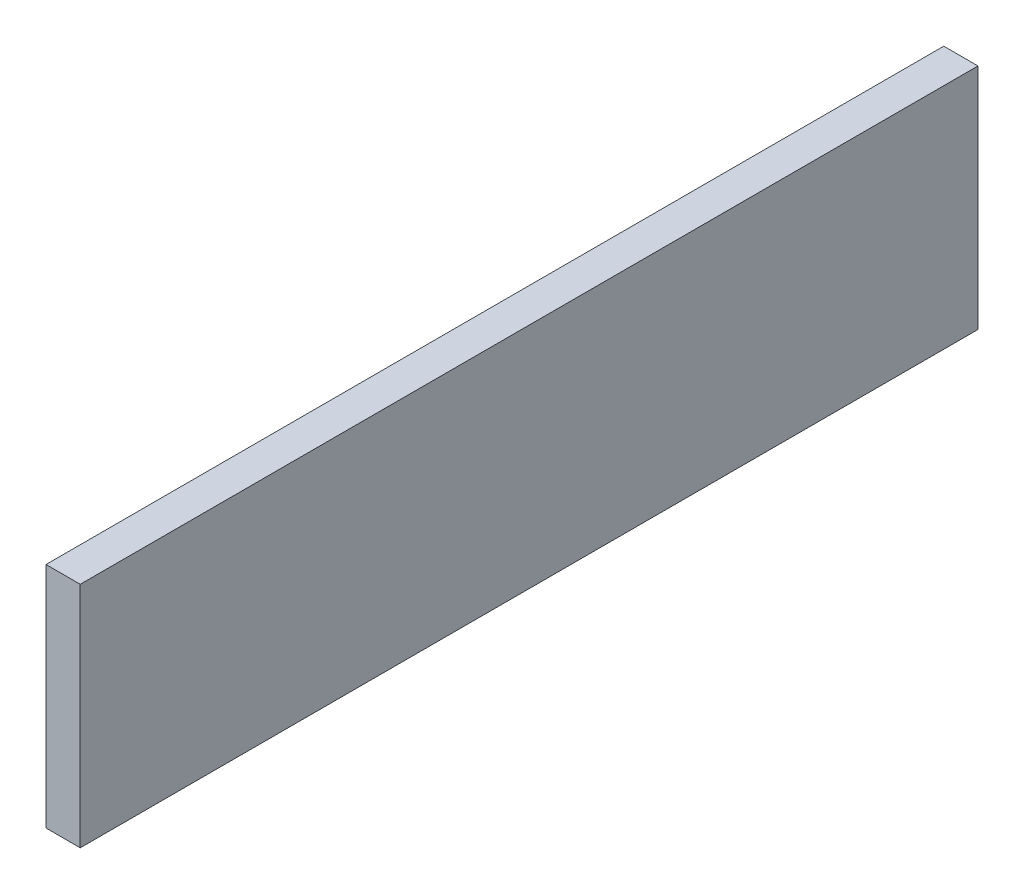
ISO-10303-21;
HEADER;
FILE_DESCRIPTION(('STEP AP214'),'2;1');
FILE_NAME('part.step','',(''),(''),'','','');
FILE_SCHEMA(('AUTOMOTIVE_DESIGN { 1 0 10303 214 1 1 1 1 }'));
ENDSEC;
DATA;
#1=APPLICATION_CONTEXT('core data for automotive mechanical design processes');
#2=APPLICATION_PROTOCOL_DEFINITION('international standard','automotive_design',2000,#1);
#3=PRODUCT_CONTEXT('',#1,'mechanical');
#4=PRODUCT('Part','Part','',(#3));
#5=PRODUCT_RELATED_PRODUCT_CATEGORY('part','',(#4));
#6=PRODUCT_DEFINITION_FORMATION('','',#4);
#7=PRODUCT_DEFINITION_CONTEXT('part definition',#1,'design');
#8=PRODUCT_DEFINITION('design','',#6,#7);
#9=PRODUCT_DEFINITION_SHAPE('','',#8);
#10=(LENGTH_UNIT() NAMED_UNIT(*) SI_UNIT(.MILLI.,.METRE.));
#11=(NAMED_UNIT(*) PLANE_ANGLE_UNIT() SI_UNIT($,.RADIAN.));
#12=(NAMED_UNIT(*) SI_UNIT($,.STERADIAN.) SOLID_ANGLE_UNIT());
#13=UNCERTAINTY_MEASURE_WITH_UNIT(LENGTH_MEASURE(1.E-05),#10,'distance_accuracy_value','');
#14=(GEOMETRIC_REPRESENTATION_CONTEXT(3) GLOBAL_UNCERTAINTY_ASSIGNED_CONTEXT((#13)) GLOBAL_UNIT_ASSIGNED_CONTEXT((#10,
#11,#12)) REPRESENTATION_CONTEXT('',''));
#15=CARTESIAN_POINT('',(0.,0.,0.));
#16=DIRECTION('',(0.,0.,1.));
#17=DIRECTION('',(1.,0.,0.));
#18=AXIS2_PLACEMENT_3D('',#15,#16,#17);
#19=CARTESIAN_POINT('',(18.,0.,0.));
#20=DIRECTION('',(0.,0.,-1.));
#21=DIRECTION('',(-1.,0.,0.));
#22=AXIS2_PLACEMENT_3D('',#19,#20,#21);
#23=PLANE('',#22);
#24=DIRECTION('',(0.,-1.,0.));
#25=VECTOR('',#24,1.);
#26=CARTESIAN_POINT('',(0.,0.,0.));
#27=LINE('',#26,#25);
#28=CARTESIAN_POINT('',(0.,120.,0.));
#29=VERTEX_POINT('',#28);
#30=CARTESIAN_POINT('',(0.,0.,0.));
#31=VERTEX_POINT('',#30);
#32=EDGE_CURVE('E96',#29,#31,#27,.T.);
#33=ORIENTED_EDGE('',*,*,#32,.T.);
#34=DIRECTION('',(-1.,0.,0.));
#35=VECTOR('',#34,1.);
#36=CARTESIAN_POINT('',(18.,0.,0.));
#37=LINE('',#36,#35);
#38=CARTESIAN_POINT('',(18.,0.,0.));
#39=VERTEX_POINT('',#38);
#40=EDGE_CURVE('E11',#39,#31,#37,.T.);
#41=ORIENTED_EDGE('',*,*,#40,.F.);
#42=DIRECTION('',(0.,-1.,0.));
#43=VECTOR('',#42,1.);
#44=CARTESIAN_POINT('',(18.,0.,0.));
#45=LINE('',#44,#43);
#46=CARTESIAN_POINT('',(18.,120.,0.));
#47=VERTEX_POINT('',#46);
#48=EDGE_CURVE('E84',#47,#39,#45,.T.);
#49=ORIENTED_EDGE('',*,*,#48,.F.);
#50=DIRECTION('',(-1.,0.,0.));
#51=VECTOR('',#50,1.);
#52=CARTESIAN_POINT('',(18.,120.,0.));
#53=LINE('',#52,#51);
#54=EDGE_CURVE('E92',#47,#29,#53,.T.);
#55=ORIENTED_EDGE('',*,*,#54,.T.);
#56=EDGE_LOOP('',(#33,#41,#49,#55));
#57=FACE_BOUND('',#56,.T.);
#58=ADVANCED_FACE('F33',(#57),#23,.F.);
#59=CARTESIAN_POINT('',(18.,0.,0.));
#60=DIRECTION('',(0.,1.,0.));
#61=DIRECTION('',(0.,0.,1.));
#62=AXIS2_PLACEMENT_3D('',#59,#60,#61);
#63=PLANE('',#62);
#64=DIRECTION('',(0.,0.,-1.));
#65=VECTOR('',#64,1.);
#66=CARTESIAN_POINT('',(0.,0.,0.));
#67=LINE('',#66,#65);
#68=CARTESIAN_POINT('',(0.,0.,-472.));
#69=VERTEX_POINT('',#68);
#70=EDGE_CURVE('E88',#31,#69,#67,.T.);
#71=ORIENTED_EDGE('',*,*,#70,.T.);
#72=DIRECTION('',(-1.,0.,0.));
#73=VECTOR('',#72,1.);
#74=CARTESIAN_POINT('',(18.,0.,-472.));
#75=LINE('',#74,#73);
#76=CARTESIAN_POINT('',(18.,0.,-472.));
#77=VERTEX_POINT('',#76);
#78=EDGE_CURVE('E41',#77,#69,#75,.T.);
#79=ORIENTED_EDGE('',*,*,#78,.F.);
#80=DIRECTION('',(0.,0.,-1.));
#81=VECTOR('',#80,1.);
#82=CARTESIAN_POINT('',(18.,0.,0.));
#83=LINE('',#82,#81);
#84=EDGE_CURVE('E79',#39,#77,#83,.T.);
#85=ORIENTED_EDGE('',*,*,#84,.F.);
#86=ORIENTED_EDGE('',*,*,#40,.T.);
#87=EDGE_LOOP('',(#71,#79,#85,#86));
#88=FACE_BOUND('',#87,.T.);
#89=ADVANCED_FACE('F87',(#88),#63,.F.);
#90=CARTESIAN_POINT('',(18.,0.,-472.));
#91=DIRECTION('',(0.,0.,1.));
#92=DIRECTION('',(1.,0.,0.));
#93=AXIS2_PLACEMENT_3D('',#90,#91,#92);
#94=PLANE('',#93);
#95=DIRECTION('',(0.,1.,0.));
#96=VECTOR('',#95,1.);
#97=CARTESIAN_POINT('',(0.,0.,-472.));
#98=LINE('',#97,#96);
#99=CARTESIAN_POINT('',(0.,120.,-472.));
#100=VERTEX_POINT('',#99);
#101=EDGE_CURVE('E66',#69,#100,#98,.T.);
#102=ORIENTED_EDGE('',*,*,#101,.T.);
#103=DIRECTION('',(-1.,0.,0.));
#104=VECTOR('',#103,1.);
#105=CARTESIAN_POINT('',(18.,120.,-472.));
#106=LINE('',#105,#104);
#107=CARTESIAN_POINT('',(18.,120.,-472.));
#108=VERTEX_POINT('',#107);
#109=EDGE_CURVE('E89',#108,#100,#106,.T.);
#110=ORIENTED_EDGE('',*,*,#109,.F.);
#111=DIRECTION('',(0.,1.,0.));
#112=VECTOR('',#111,1.);
#113=CARTESIAN_POINT('',(18.,0.,-472.));
#114=LINE('',#113,#112);
#115=EDGE_CURVE('E82',#77,#108,#114,.T.);
#116=ORIENTED_EDGE('',*,*,#115,.F.);
#117=ORIENTED_EDGE('',*,*,#78,.T.);
#118=EDGE_LOOP('',(#102,#110,#116,#117));
#119=FACE_BOUND('',#118,.T.);
#120=ADVANCED_FACE('F90',(#119),#94,.F.);
#121=CARTESIAN_POINT('',(18.,120.,0.));
#122=DIRECTION('',(0.,-1.,0.));
#123=DIRECTION('',(0.,0.,-1.));
#124=AXIS2_PLACEMENT_3D('',#121,#122,#123);
#125=PLANE('',#124);
#126=DIRECTION('',(0.,0.,1.));
#127=VECTOR('',#126,1.);
#128=CARTESIAN_POINT('',(0.,120.,0.));
#129=LINE('',#128,#127);
#130=EDGE_CURVE('E72',#100,#29,#129,.T.);
#131=ORIENTED_EDGE('',*,*,#130,.T.);
#132=ORIENTED_EDGE('',*,*,#54,.F.);
#133=DIRECTION('',(0.,0.,1.));
#134=VECTOR('',#133,1.);
#135=CARTESIAN_POINT('',(18.,120.,0.));
#136=LINE('',#135,#134);
#137=EDGE_CURVE('E49',#108,#47,#136,.T.);
#138=ORIENTED_EDGE('',*,*,#137,.F.);
#139=ORIENTED_EDGE('',*,*,#109,.T.);
#140=EDGE_LOOP('',(#131,#132,#138,#139));
#141=FACE_BOUND('',#140,.T.);
#142=ADVANCED_FACE('F103',(#141),#125,.F.);
#143=CARTESIAN_POINT('',(18.,0.,0.));
#144=DIRECTION('',(-1.,0.,0.));
#145=DIRECTION('',(0.,0.,1.));
#146=AXIS2_PLACEMENT_3D('',#143,#144,#145);
#147=PLANE('',#146);
#148=ORIENTED_EDGE('',*,*,#48,.T.);
#149=ORIENTED_EDGE('',*,*,#84,.T.);
#150=ORIENTED_EDGE('',*,*,#115,.T.);
#151=ORIENTED_EDGE('',*,*,#137,.T.);
#152=EDGE_LOOP('',(#148,#149,#150,#151));
#153=FACE_BOUND('',#152,.T.);
#154=ADVANCED_FACE('F80',(#153),#147,.F.);
#155=CARTESIAN_POINT('',(0.,0.,0.));
#156=DIRECTION('',(-1.,0.,0.));
#157=DIRECTION('',(0.,0.,1.));
#158=AXIS2_PLACEMENT_3D('',#155,#156,#157);
#159=PLANE('',#158);
#160=ORIENTED_EDGE('',*,*,#32,.F.);
#161=ORIENTED_EDGE('',*,*,#130,.F.);
#162=ORIENTED_EDGE('',*,*,#101,.F.);
#163=ORIENTED_EDGE('',*,*,#70,.F.);
#164=EDGE_LOOP('',(#160,#161,#162,#163));
#165=FACE_BOUND('',#164,.T.);
#166=ADVANCED_FACE('F106',(#165),#159,.T.);
#167=CLOSED_SHELL('',(#58,#89,#120,#142,#154,#166));
#168=MANIFOLD_SOLID_BREP('B2',#167);
#169=ADVANCED_BREP_SHAPE_REPRESENTATION('',(#18,#168),#14);
#170=SHAPE_DEFINITION_REPRESENTATION(#9,#169);
ENDSEC;
END-ISO-10303-21;
